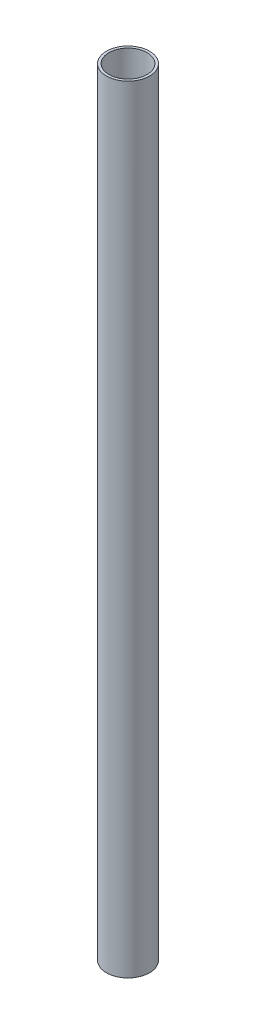
ISO-10303-21;
HEADER;
FILE_DESCRIPTION(('STEP AP214'),'2;1');
FILE_NAME('part.step','',(''),(''),'','','');
FILE_SCHEMA(('AUTOMOTIVE_DESIGN { 1 0 10303 214 1 1 1 1 }'));
ENDSEC;
DATA;
#1=APPLICATION_CONTEXT('core data for automotive mechanical design processes');
#2=APPLICATION_PROTOCOL_DEFINITION('international standard','automotive_design',2000,#1);
#3=PRODUCT_CONTEXT('',#1,'mechanical');
#4=PRODUCT('Part','Part','',(#3));
#5=PRODUCT_RELATED_PRODUCT_CATEGORY('part','',(#4));
#6=PRODUCT_DEFINITION_FORMATION('','',#4);
#7=PRODUCT_DEFINITION_CONTEXT('part definition',#1,'design');
#8=PRODUCT_DEFINITION('design','',#6,#7);
#9=PRODUCT_DEFINITION_SHAPE('','',#8);
#10=(LENGTH_UNIT() NAMED_UNIT(*) SI_UNIT(.MILLI.,.METRE.));
#11=(NAMED_UNIT(*) PLANE_ANGLE_UNIT() SI_UNIT($,.RADIAN.));
#12=(NAMED_UNIT(*) SI_UNIT($,.STERADIAN.) SOLID_ANGLE_UNIT());
#13=UNCERTAINTY_MEASURE_WITH_UNIT(LENGTH_MEASURE(1.E-05),#10,'distance_accuracy_value','');
#14=(GEOMETRIC_REPRESENTATION_CONTEXT(3) GLOBAL_UNCERTAINTY_ASSIGNED_CONTEXT((#13)) GLOBAL_UNIT_ASSIGNED_CONTEXT((#10,
#11,#12)) REPRESENTATION_CONTEXT('',''));
#15=CARTESIAN_POINT('',(0.,0.,0.));
#16=DIRECTION('',(0.,0.,1.));
#17=DIRECTION('',(1.,0.,0.));
#18=AXIS2_PLACEMENT_3D('',#15,#16,#17);
#19=CARTESIAN_POINT('',(163.047462271699,34.1516094451203,0.));
#20=DIRECTION('',(0.,1.,0.));
#21=DIRECTION('',(-1.,0.,0.));
#22=AXIS2_PLACEMENT_3D('',#19,#20,#21);
#23=CYLINDRICAL_SURFACE('',#22,6.35);
#24=CARTESIAN_POINT('',(163.047462271699,52.1121216872586,0.));
#25=DIRECTION('',(0.,-1.,0.));
#26=DIRECTION('',(0.837169104331223,0.,-0.546944138603988));
#27=AXIS2_PLACEMENT_3D('',#24,#25,#26);
#28=CIRCLE('',#27,6.35);
#29=CARTESIAN_POINT('',(168.363486084203,52.1121216872586,-3.47309528013527));
#30=VERTEX_POINT('',#29);
#31=EDGE_CURVE('E41',#30,#30,#28,.T.);
#32=ORIENTED_EDGE('',*,*,#31,.F.);
#33=EDGE_LOOP('',(#32));
#34=FACE_BOUND('',#33,.T.);
#35=CARTESIAN_POINT('',(163.047462271699,280.991966611506,0.));
#36=DIRECTION('',(0.,1.,0.));
#37=DIRECTION('',(-1.,0.,0.));
#38=AXIS2_PLACEMENT_3D('',#35,#36,#37);
#39=CIRCLE('',#38,6.35);
#40=CARTESIAN_POINT('',(156.697462271699,280.991966611506,0.));
#41=VERTEX_POINT('',#40);
#42=EDGE_CURVE('E45',#41,#41,#39,.T.);
#43=ORIENTED_EDGE('',*,*,#42,.F.);
#44=EDGE_LOOP('',(#43));
#45=FACE_BOUND('',#44,.T.);
#46=ADVANCED_FACE('F35',(#34,#45),#23,.T.);
#47=CARTESIAN_POINT('',(163.047462271699,34.1516094451203,0.));
#48=DIRECTION('',(0.,1.,0.));
#49=DIRECTION('',(-1.,0.,0.));
#50=AXIS2_PLACEMENT_3D('',#47,#48,#49);
#51=CYLINDRICAL_SURFACE('',#50,5.6134);
#52=CARTESIAN_POINT('',(163.047462271699,52.1121216872586,0.));
#53=DIRECTION('',(0.,-1.,0.));
#54=DIRECTION('',(-1.,0.,0.));
#55=AXIS2_PLACEMENT_3D('',#52,#53,#54);
#56=CIRCLE('',#55,5.6134);
#57=CARTESIAN_POINT('',(157.434062271699,52.1121216872586,0.));
#58=VERTEX_POINT('',#57);
#59=EDGE_CURVE('E10',#58,#58,#56,.F.);
#60=ORIENTED_EDGE('',*,*,#59,.F.);
#61=EDGE_LOOP('',(#60));
#62=FACE_BOUND('',#61,.T.);
#63=CARTESIAN_POINT('',(163.047462271699,280.991966611506,0.));
#64=DIRECTION('',(0.,1.,0.));
#65=DIRECTION('',(1.,0.,0.));
#66=AXIS2_PLACEMENT_3D('',#63,#64,#65);
#67=CIRCLE('',#66,5.6134);
#68=CARTESIAN_POINT('',(168.660862271699,280.991966611506,0.));
#69=VERTEX_POINT('',#68);
#70=EDGE_CURVE('E49',#69,#69,#67,.T.);
#71=ORIENTED_EDGE('',*,*,#70,.T.);
#72=EDGE_LOOP('',(#71));
#73=FACE_BOUND('',#72,.T.);
#74=ADVANCED_FACE('F55',(#62,#73),#51,.F.);
#75=CARTESIAN_POINT('',(163.047462271699,52.1121216872586,0.));
#76=DIRECTION('',(0.,1.,0.));
#77=DIRECTION('',(0.837169104331223,0.,-0.546944138603988));
#78=AXIS2_PLACEMENT_3D('',#75,#76,#77);
#79=PLANE('',#78);
#80=ORIENTED_EDGE('',*,*,#31,.T.);
#81=EDGE_LOOP('',(#80));
#82=FACE_BOUND('',#81,.T.);
#83=ORIENTED_EDGE('',*,*,#59,.T.);
#84=EDGE_LOOP('',(#83));
#85=FACE_BOUND('',#84,.T.);
#86=ADVANCED_FACE('F60',(#82,#85),#79,.F.);
#87=CARTESIAN_POINT('',(163.047462271699,280.991966611506,0.));
#88=DIRECTION('',(0.,-1.,0.));
#89=DIRECTION('',(-1.,0.,0.));
#90=AXIS2_PLACEMENT_3D('',#87,#88,#89);
#91=PLANE('',#90);
#92=ORIENTED_EDGE('',*,*,#70,.F.);
#93=EDGE_LOOP('',(#92));
#94=FACE_BOUND('',#93,.T.);
#95=ORIENTED_EDGE('',*,*,#42,.T.);
#96=EDGE_LOOP('',(#95));
#97=FACE_BOUND('',#96,.T.);
#98=ADVANCED_FACE('F57',(#94,#97),#91,.F.);
#99=CLOSED_SHELL('',(#46,#74,#86,#98));
#100=MANIFOLD_SOLID_BREP('B2',#99);
#101=ADVANCED_BREP_SHAPE_REPRESENTATION('',(#18,#100),#14);
#102=SHAPE_DEFINITION_REPRESENTATION(#9,#101);
ENDSEC;
END-ISO-10303-21;
